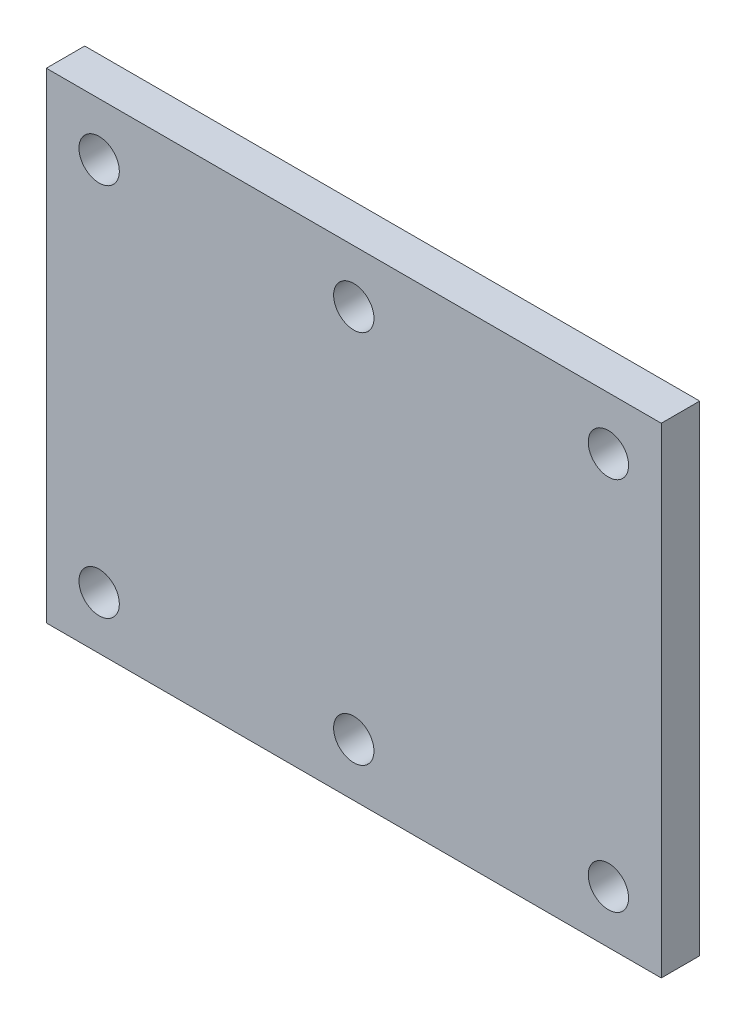
ISO-10303-21;
HEADER;
FILE_DESCRIPTION(('STEP AP214'),'2;1');
FILE_NAME('part.step','',(''),(''),'','','');
FILE_SCHEMA(('AUTOMOTIVE_DESIGN { 1 0 10303 214 1 1 1 1 }'));
ENDSEC;
DATA;
#1=APPLICATION_CONTEXT('core data for automotive mechanical design processes');
#2=APPLICATION_PROTOCOL_DEFINITION('international standard','automotive_design',2000,#1);
#3=PRODUCT_CONTEXT('',#1,'mechanical');
#4=PRODUCT('Part','Part','',(#3));
#5=PRODUCT_RELATED_PRODUCT_CATEGORY('part','',(#4));
#6=PRODUCT_DEFINITION_FORMATION('','',#4);
#7=PRODUCT_DEFINITION_CONTEXT('part definition',#1,'design');
#8=PRODUCT_DEFINITION('design','',#6,#7);
#9=PRODUCT_DEFINITION_SHAPE('','',#8);
#10=(LENGTH_UNIT() NAMED_UNIT(*) SI_UNIT(.MILLI.,.METRE.));
#11=(NAMED_UNIT(*) PLANE_ANGLE_UNIT() SI_UNIT($,.RADIAN.));
#12=(NAMED_UNIT(*) SI_UNIT($,.STERADIAN.) SOLID_ANGLE_UNIT());
#13=UNCERTAINTY_MEASURE_WITH_UNIT(LENGTH_MEASURE(1.E-05),#10,'distance_accuracy_value','');
#14=(GEOMETRIC_REPRESENTATION_CONTEXT(3) GLOBAL_UNCERTAINTY_ASSIGNED_CONTEXT((#13)) GLOBAL_UNIT_ASSIGNED_CONTEXT((#10,
#11,#12)) REPRESENTATION_CONTEXT('',''));
#15=CARTESIAN_POINT('',(0.,0.,0.));
#16=DIRECTION('',(0.,0.,1.));
#17=DIRECTION('',(1.,0.,0.));
#18=AXIS2_PLACEMENT_3D('',#15,#16,#17);
#19=CARTESIAN_POINT('',(0.,0.,4.));
#20=DIRECTION('',(0.,0.,1.));
#21=DIRECTION('',(1.,0.,0.));
#22=AXIS2_PLACEMENT_3D('',#19,#20,#21);
#23=PLANE('',#22);
#24=CARTESIAN_POINT('',(0.,19.5,4.));
#25=DIRECTION('',(0.,0.,1.));
#26=DIRECTION('',(1.,0.,0.));
#27=AXIS2_PLACEMENT_3D('',#24,#25,#26);
#28=CIRCLE('',#27,2.1);
#29=CARTESIAN_POINT('',(2.1,19.5,4.));
#30=VERTEX_POINT('',#29);
#31=EDGE_CURVE('E139',#30,#30,#28,.T.);
#32=ORIENTED_EDGE('',*,*,#31,.F.);
#33=EDGE_LOOP('',(#32));
#34=FACE_BOUND('',#33,.T.);
#35=CARTESIAN_POINT('',(-26.5,-19.5,4.));
#36=DIRECTION('',(0.,0.,1.));
#37=DIRECTION('',(1.,0.,0.));
#38=AXIS2_PLACEMENT_3D('',#35,#36,#37);
#39=CIRCLE('',#38,2.1);
#40=CARTESIAN_POINT('',(-24.4,-19.5,4.));
#41=VERTEX_POINT('',#40);
#42=EDGE_CURVE('E127',#41,#41,#39,.T.);
#43=ORIENTED_EDGE('',*,*,#42,.F.);
#44=EDGE_LOOP('',(#43));
#45=FACE_BOUND('',#44,.T.);
#46=CARTESIAN_POINT('',(-26.5,19.5,4.));
#47=DIRECTION('',(0.,0.,1.));
#48=DIRECTION('',(1.,0.,0.));
#49=AXIS2_PLACEMENT_3D('',#46,#47,#48);
#50=CIRCLE('',#49,2.1);
#51=CARTESIAN_POINT('',(-24.4,19.5,4.));
#52=VERTEX_POINT('',#51);
#53=EDGE_CURVE('E106',#52,#52,#50,.T.);
#54=ORIENTED_EDGE('',*,*,#53,.F.);
#55=EDGE_LOOP('',(#54));
#56=FACE_BOUND('',#55,.T.);
#57=DIRECTION('',(0.,1.,0.));
#58=VECTOR('',#57,1.);
#59=CARTESIAN_POINT('',(32.,25.,4.));
#60=LINE('',#59,#58);
#61=CARTESIAN_POINT('',(32.,-25.,4.));
#62=VERTEX_POINT('',#61);
#63=CARTESIAN_POINT('',(32.,25.,4.));
#64=VERTEX_POINT('',#63);
#65=EDGE_CURVE('E91',#62,#64,#60,.T.);
#66=ORIENTED_EDGE('',*,*,#65,.T.);
#67=DIRECTION('',(-1.,0.,0.));
#68=VECTOR('',#67,1.);
#69=CARTESIAN_POINT('',(-32.,25.,4.));
#70=LINE('',#69,#68);
#71=CARTESIAN_POINT('',(-32.,25.,4.));
#72=VERTEX_POINT('',#71);
#73=EDGE_CURVE('E86',#64,#72,#70,.T.);
#74=ORIENTED_EDGE('',*,*,#73,.T.);
#75=DIRECTION('',(0.,-1.,0.));
#76=VECTOR('',#75,1.);
#77=CARTESIAN_POINT('',(-32.,25.,4.));
#78=LINE('',#77,#76);
#79=CARTESIAN_POINT('',(-32.,-25.,4.));
#80=VERTEX_POINT('',#79);
#81=EDGE_CURVE('E89',#72,#80,#78,.T.);
#82=ORIENTED_EDGE('',*,*,#81,.T.);
#83=DIRECTION('',(1.,0.,0.));
#84=VECTOR('',#83,1.);
#85=CARTESIAN_POINT('',(-32.,-25.,4.));
#86=LINE('',#85,#84);
#87=EDGE_CURVE('E56',#80,#62,#86,.T.);
#88=ORIENTED_EDGE('',*,*,#87,.T.);
#89=EDGE_LOOP('',(#66,#74,#82,#88));
#90=FACE_BOUND('',#89,.T.);
#91=CARTESIAN_POINT('',(26.5,19.5,4.));
#92=DIRECTION('',(0.,0.,1.));
#93=DIRECTION('',(1.,0.,0.));
#94=AXIS2_PLACEMENT_3D('',#91,#92,#93);
#95=CIRCLE('',#94,2.1);
#96=CARTESIAN_POINT('',(28.6,19.5,4.));
#97=VERTEX_POINT('',#96);
#98=EDGE_CURVE('E121',#97,#97,#95,.T.);
#99=ORIENTED_EDGE('',*,*,#98,.F.);
#100=EDGE_LOOP('',(#99));
#101=FACE_BOUND('',#100,.T.);
#102=CARTESIAN_POINT('',(26.5,-19.5,4.));
#103=DIRECTION('',(0.,0.,1.));
#104=DIRECTION('',(1.,0.,0.));
#105=AXIS2_PLACEMENT_3D('',#102,#103,#104);
#106=CIRCLE('',#105,2.1);
#107=CARTESIAN_POINT('',(28.6,-19.5,4.));
#108=VERTEX_POINT('',#107);
#109=EDGE_CURVE('E133',#108,#108,#106,.T.);
#110=ORIENTED_EDGE('',*,*,#109,.F.);
#111=EDGE_LOOP('',(#110));
#112=FACE_BOUND('',#111,.T.);
#113=CARTESIAN_POINT('',(0.,-19.5,4.));
#114=DIRECTION('',(0.,0.,1.));
#115=DIRECTION('',(1.,0.,0.));
#116=AXIS2_PLACEMENT_3D('',#113,#114,#115);
#117=CIRCLE('',#116,2.1);
#118=CARTESIAN_POINT('',(2.1,-19.5,4.));
#119=VERTEX_POINT('',#118);
#120=EDGE_CURVE('E145',#119,#119,#117,.T.);
#121=ORIENTED_EDGE('',*,*,#120,.F.);
#122=EDGE_LOOP('',(#121));
#123=FACE_BOUND('',#122,.T.);
#124=ADVANCED_FACE('F39',(#34,#45,#56,#90,#101,#112,#123),#23,.T.);
#125=CARTESIAN_POINT('',(0.,0.,0.));
#126=DIRECTION('',(0.,0.,1.));
#127=DIRECTION('',(1.,0.,0.));
#128=AXIS2_PLACEMENT_3D('',#125,#126,#127);
#129=PLANE('',#128);
#130=DIRECTION('',(0.,1.,0.));
#131=VECTOR('',#130,1.);
#132=CARTESIAN_POINT('',(32.,25.,0.));
#133=LINE('',#132,#131);
#134=CARTESIAN_POINT('',(32.,-25.,0.));
#135=VERTEX_POINT('',#134);
#136=CARTESIAN_POINT('',(32.,25.,0.));
#137=VERTEX_POINT('',#136);
#138=EDGE_CURVE('E103',#135,#137,#133,.T.);
#139=ORIENTED_EDGE('',*,*,#138,.F.);
#140=DIRECTION('',(1.,0.,0.));
#141=VECTOR('',#140,1.);
#142=CARTESIAN_POINT('',(-32.,-25.,0.));
#143=LINE('',#142,#141);
#144=CARTESIAN_POINT('',(-32.,-25.,0.));
#145=VERTEX_POINT('',#144);
#146=EDGE_CURVE('E79',#145,#135,#143,.T.);
#147=ORIENTED_EDGE('',*,*,#146,.F.);
#148=DIRECTION('',(0.,-1.,0.));
#149=VECTOR('',#148,1.);
#150=CARTESIAN_POINT('',(-32.,25.,0.));
#151=LINE('',#150,#149);
#152=CARTESIAN_POINT('',(-32.,25.,0.));
#153=VERTEX_POINT('',#152);
#154=EDGE_CURVE('E73',#153,#145,#151,.T.);
#155=ORIENTED_EDGE('',*,*,#154,.F.);
#156=DIRECTION('',(-1.,0.,0.));
#157=VECTOR('',#156,1.);
#158=CARTESIAN_POINT('',(-32.,25.,0.));
#159=LINE('',#158,#157);
#160=EDGE_CURVE('E95',#137,#153,#159,.T.);
#161=ORIENTED_EDGE('',*,*,#160,.F.);
#162=EDGE_LOOP('',(#139,#147,#155,#161));
#163=FACE_BOUND('',#162,.T.);
#164=CARTESIAN_POINT('',(-26.5,19.5,0.));
#165=DIRECTION('',(0.,0.,1.));
#166=DIRECTION('',(1.,0.,0.));
#167=AXIS2_PLACEMENT_3D('',#164,#165,#166);
#168=CIRCLE('',#167,2.1);
#169=CARTESIAN_POINT('',(-24.4,19.5,0.));
#170=VERTEX_POINT('',#169);
#171=EDGE_CURVE('E118',#170,#170,#168,.T.);
#172=ORIENTED_EDGE('',*,*,#171,.T.);
#173=EDGE_LOOP('',(#172));
#174=FACE_BOUND('',#173,.T.);
#175=CARTESIAN_POINT('',(26.5,19.5,0.));
#176=DIRECTION('',(0.,0.,1.));
#177=DIRECTION('',(1.,0.,0.));
#178=AXIS2_PLACEMENT_3D('',#175,#176,#177);
#179=CIRCLE('',#178,2.1);
#180=CARTESIAN_POINT('',(28.6,19.5,0.));
#181=VERTEX_POINT('',#180);
#182=EDGE_CURVE('E124',#181,#181,#179,.T.);
#183=ORIENTED_EDGE('',*,*,#182,.T.);
#184=EDGE_LOOP('',(#183));
#185=FACE_BOUND('',#184,.T.);
#186=CARTESIAN_POINT('',(-26.5,-19.5,0.));
#187=DIRECTION('',(0.,0.,1.));
#188=DIRECTION('',(1.,0.,0.));
#189=AXIS2_PLACEMENT_3D('',#186,#187,#188);
#190=CIRCLE('',#189,2.1);
#191=CARTESIAN_POINT('',(-24.4,-19.5,0.));
#192=VERTEX_POINT('',#191);
#193=EDGE_CURVE('E130',#192,#192,#190,.T.);
#194=ORIENTED_EDGE('',*,*,#193,.T.);
#195=EDGE_LOOP('',(#194));
#196=FACE_BOUND('',#195,.T.);
#197=CARTESIAN_POINT('',(26.5,-19.5,0.));
#198=DIRECTION('',(0.,0.,1.));
#199=DIRECTION('',(1.,0.,0.));
#200=AXIS2_PLACEMENT_3D('',#197,#198,#199);
#201=CIRCLE('',#200,2.1);
#202=CARTESIAN_POINT('',(28.6,-19.5,0.));
#203=VERTEX_POINT('',#202);
#204=EDGE_CURVE('E136',#203,#203,#201,.T.);
#205=ORIENTED_EDGE('',*,*,#204,.T.);
#206=EDGE_LOOP('',(#205));
#207=FACE_BOUND('',#206,.T.);
#208=CARTESIAN_POINT('',(0.,19.5,0.));
#209=DIRECTION('',(0.,0.,1.));
#210=DIRECTION('',(1.,0.,0.));
#211=AXIS2_PLACEMENT_3D('',#208,#209,#210);
#212=CIRCLE('',#211,2.1);
#213=CARTESIAN_POINT('',(2.1,19.5,0.));
#214=VERTEX_POINT('',#213);
#215=EDGE_CURVE('E142',#214,#214,#212,.T.);
#216=ORIENTED_EDGE('',*,*,#215,.T.);
#217=EDGE_LOOP('',(#216));
#218=FACE_BOUND('',#217,.T.);
#219=CARTESIAN_POINT('',(0.,-19.5,0.));
#220=DIRECTION('',(0.,0.,1.));
#221=DIRECTION('',(1.,0.,0.));
#222=AXIS2_PLACEMENT_3D('',#219,#220,#221);
#223=CIRCLE('',#222,2.1);
#224=CARTESIAN_POINT('',(2.1,-19.5,0.));
#225=VERTEX_POINT('',#224);
#226=EDGE_CURVE('E148',#225,#225,#223,.T.);
#227=ORIENTED_EDGE('',*,*,#226,.T.);
#228=EDGE_LOOP('',(#227));
#229=FACE_BOUND('',#228,.T.);
#230=ADVANCED_FACE('F114',(#163,#174,#185,#196,#207,#218,#229),#129,.F.);
#231=CARTESIAN_POINT('',(32.,25.,4.));
#232=DIRECTION('',(-1.,0.,0.));
#233=DIRECTION('',(0.,0.,1.));
#234=AXIS2_PLACEMENT_3D('',#231,#232,#233);
#235=PLANE('',#234);
#236=ORIENTED_EDGE('',*,*,#138,.T.);
#237=DIRECTION('',(0.,0.,-1.));
#238=VECTOR('',#237,1.);
#239=CARTESIAN_POINT('',(32.,25.,4.));
#240=LINE('',#239,#238);
#241=EDGE_CURVE('E11',#64,#137,#240,.T.);
#242=ORIENTED_EDGE('',*,*,#241,.F.);
#243=ORIENTED_EDGE('',*,*,#65,.F.);
#244=DIRECTION('',(0.,0.,-1.));
#245=VECTOR('',#244,1.);
#246=CARTESIAN_POINT('',(32.,-25.,4.));
#247=LINE('',#246,#245);
#248=EDGE_CURVE('E99',#62,#135,#247,.T.);
#249=ORIENTED_EDGE('',*,*,#248,.T.);
#250=EDGE_LOOP('',(#236,#242,#243,#249));
#251=FACE_BOUND('',#250,.T.);
#252=ADVANCED_FACE('F41',(#251),#235,.F.);
#253=CARTESIAN_POINT('',(-32.,25.,4.));
#254=DIRECTION('',(0.,-1.,0.));
#255=DIRECTION('',(0.,0.,-1.));
#256=AXIS2_PLACEMENT_3D('',#253,#254,#255);
#257=PLANE('',#256);
#258=ORIENTED_EDGE('',*,*,#160,.T.);
#259=DIRECTION('',(0.,0.,-1.));
#260=VECTOR('',#259,1.);
#261=CARTESIAN_POINT('',(-32.,25.,4.));
#262=LINE('',#261,#260);
#263=EDGE_CURVE('E48',#72,#153,#262,.T.);
#264=ORIENTED_EDGE('',*,*,#263,.F.);
#265=ORIENTED_EDGE('',*,*,#73,.F.);
#266=ORIENTED_EDGE('',*,*,#241,.T.);
#267=EDGE_LOOP('',(#258,#264,#265,#266));
#268=FACE_BOUND('',#267,.T.);
#269=ADVANCED_FACE('F94',(#268),#257,.F.);
#270=CARTESIAN_POINT('',(-32.,25.,4.));
#271=DIRECTION('',(1.,0.,0.));
#272=DIRECTION('',(0.,0.,-1.));
#273=AXIS2_PLACEMENT_3D('',#270,#271,#272);
#274=PLANE('',#273);
#275=ORIENTED_EDGE('',*,*,#154,.T.);
#276=DIRECTION('',(0.,0.,-1.));
#277=VECTOR('',#276,1.);
#278=CARTESIAN_POINT('',(-32.,-25.,4.));
#279=LINE('',#278,#277);
#280=EDGE_CURVE('E96',#80,#145,#279,.T.);
#281=ORIENTED_EDGE('',*,*,#280,.F.);
#282=ORIENTED_EDGE('',*,*,#81,.F.);
#283=ORIENTED_EDGE('',*,*,#263,.T.);
#284=EDGE_LOOP('',(#275,#281,#282,#283));
#285=FACE_BOUND('',#284,.T.);
#286=ADVANCED_FACE('F97',(#285),#274,.F.);
#287=CARTESIAN_POINT('',(-32.,-25.,4.));
#288=DIRECTION('',(0.,1.,0.));
#289=DIRECTION('',(0.,0.,1.));
#290=AXIS2_PLACEMENT_3D('',#287,#288,#289);
#291=PLANE('',#290);
#292=ORIENTED_EDGE('',*,*,#146,.T.);
#293=ORIENTED_EDGE('',*,*,#248,.F.);
#294=ORIENTED_EDGE('',*,*,#87,.F.);
#295=ORIENTED_EDGE('',*,*,#280,.T.);
#296=EDGE_LOOP('',(#292,#293,#294,#295));
#297=FACE_BOUND('',#296,.T.);
#298=ADVANCED_FACE('F111',(#297),#291,.F.);
#299=CARTESIAN_POINT('',(-26.5,19.5,4.));
#300=DIRECTION('',(0.,0.,-1.));
#301=DIRECTION('',(-1.,0.,0.));
#302=AXIS2_PLACEMENT_3D('',#299,#300,#301);
#303=CYLINDRICAL_SURFACE('',#302,2.1);
#304=ORIENTED_EDGE('',*,*,#53,.T.);
#305=EDGE_LOOP('',(#304));
#306=FACE_BOUND('',#305,.T.);
#307=ORIENTED_EDGE('',*,*,#171,.F.);
#308=EDGE_LOOP('',(#307));
#309=FACE_BOUND('',#308,.T.);
#310=ADVANCED_FACE('F167',(#306,#309),#303,.F.);
#311=CARTESIAN_POINT('',(26.5,19.5,4.));
#312=DIRECTION('',(0.,0.,-1.));
#313=DIRECTION('',(-1.,0.,0.));
#314=AXIS2_PLACEMENT_3D('',#311,#312,#313);
#315=CYLINDRICAL_SURFACE('',#314,2.1);
#316=ORIENTED_EDGE('',*,*,#98,.T.);
#317=EDGE_LOOP('',(#316));
#318=FACE_BOUND('',#317,.T.);
#319=ORIENTED_EDGE('',*,*,#182,.F.);
#320=EDGE_LOOP('',(#319));
#321=FACE_BOUND('',#320,.T.);
#322=ADVANCED_FACE('F235',(#318,#321),#315,.F.);
#323=CARTESIAN_POINT('',(-26.5,-19.5,4.));
#324=DIRECTION('',(0.,0.,-1.));
#325=DIRECTION('',(-1.,0.,0.));
#326=AXIS2_PLACEMENT_3D('',#323,#324,#325);
#327=CYLINDRICAL_SURFACE('',#326,2.1);
#328=ORIENTED_EDGE('',*,*,#42,.T.);
#329=EDGE_LOOP('',(#328));
#330=FACE_BOUND('',#329,.T.);
#331=ORIENTED_EDGE('',*,*,#193,.F.);
#332=EDGE_LOOP('',(#331));
#333=FACE_BOUND('',#332,.T.);
#334=ADVANCED_FACE('F246',(#330,#333),#327,.F.);
#335=CARTESIAN_POINT('',(26.5,-19.5,4.));
#336=DIRECTION('',(0.,0.,-1.));
#337=DIRECTION('',(-1.,0.,0.));
#338=AXIS2_PLACEMENT_3D('',#335,#336,#337);
#339=CYLINDRICAL_SURFACE('',#338,2.1);
#340=ORIENTED_EDGE('',*,*,#109,.T.);
#341=EDGE_LOOP('',(#340));
#342=FACE_BOUND('',#341,.T.);
#343=ORIENTED_EDGE('',*,*,#204,.F.);
#344=EDGE_LOOP('',(#343));
#345=FACE_BOUND('',#344,.T.);
#346=ADVANCED_FACE('F257',(#342,#345),#339,.F.);
#347=CARTESIAN_POINT('',(0.,19.5,4.));
#348=DIRECTION('',(0.,0.,-1.));
#349=DIRECTION('',(-1.,0.,0.));
#350=AXIS2_PLACEMENT_3D('',#347,#348,#349);
#351=CYLINDRICAL_SURFACE('',#350,2.1);
#352=ORIENTED_EDGE('',*,*,#31,.T.);
#353=EDGE_LOOP('',(#352));
#354=FACE_BOUND('',#353,.T.);
#355=ORIENTED_EDGE('',*,*,#215,.F.);
#356=EDGE_LOOP('',(#355));
#357=FACE_BOUND('',#356,.T.);
#358=ADVANCED_FACE('F269',(#354,#357),#351,.F.);
#359=CARTESIAN_POINT('',(0.,-19.5,4.));
#360=DIRECTION('',(0.,0.,-1.));
#361=DIRECTION('',(-1.,0.,0.));
#362=AXIS2_PLACEMENT_3D('',#359,#360,#361);
#363=CYLINDRICAL_SURFACE('',#362,2.1);
#364=ORIENTED_EDGE('',*,*,#120,.T.);
#365=EDGE_LOOP('',(#364));
#366=FACE_BOUND('',#365,.T.);
#367=ORIENTED_EDGE('',*,*,#226,.F.);
#368=EDGE_LOOP('',(#367));
#369=FACE_BOUND('',#368,.T.);
#370=ADVANCED_FACE('F154',(#366,#369),#363,.F.);
#371=CLOSED_SHELL('',(#124,#230,#252,#269,#286,#298,#310,#322,#334,#346,#358,#370));
#372=MANIFOLD_SOLID_BREP('B2',#371);
#373=ADVANCED_BREP_SHAPE_REPRESENTATION('',(#18,#372),#14);
#374=SHAPE_DEFINITION_REPRESENTATION(#9,#373);
ENDSEC;
END-ISO-10303-21;
